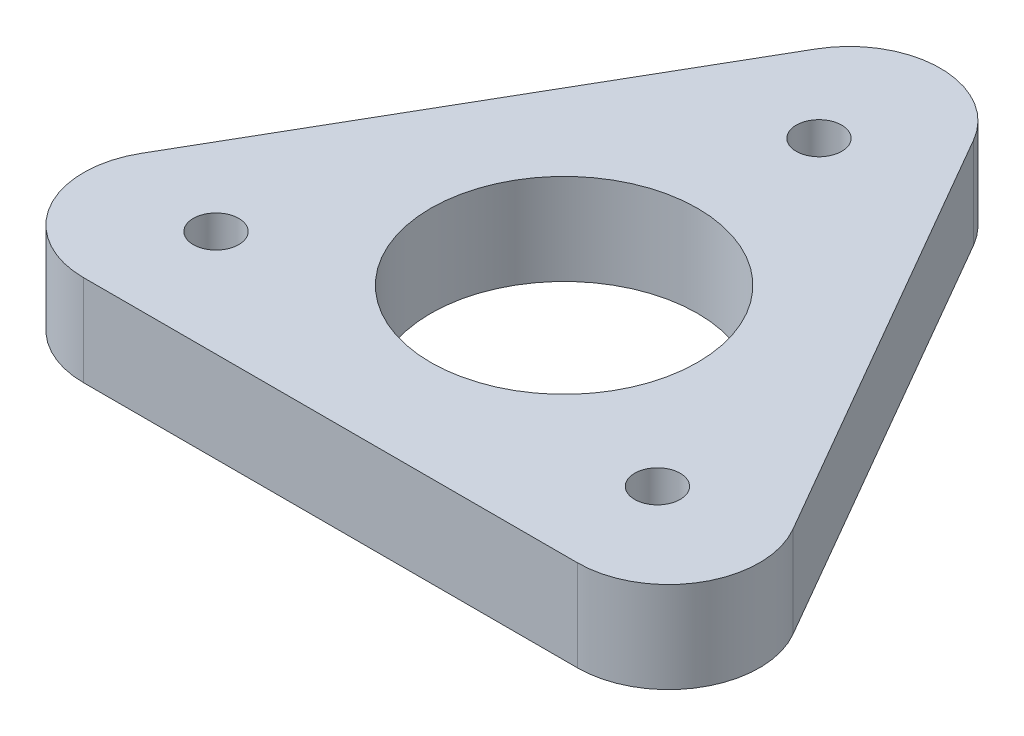
ISO-10303-21;
HEADER;
FILE_DESCRIPTION(('STEP AP214'),'2;1');
FILE_NAME('part.step','',(''),(''),'','','');
FILE_SCHEMA(('AUTOMOTIVE_DESIGN { 1 0 10303 214 1 1 1 1 }'));
ENDSEC;
DATA;
#1=APPLICATION_CONTEXT('core data for automotive mechanical design processes');
#2=APPLICATION_PROTOCOL_DEFINITION('international standard','automotive_design',2000,#1);
#3=PRODUCT_CONTEXT('',#1,'mechanical');
#4=PRODUCT('Part','Part','',(#3));
#5=PRODUCT_RELATED_PRODUCT_CATEGORY('part','',(#4));
#6=PRODUCT_DEFINITION_FORMATION('','',#4);
#7=PRODUCT_DEFINITION_CONTEXT('part definition',#1,'design');
#8=PRODUCT_DEFINITION('design','',#6,#7);
#9=PRODUCT_DEFINITION_SHAPE('','',#8);
#10=(LENGTH_UNIT() NAMED_UNIT(*) SI_UNIT(.MILLI.,.METRE.));
#11=(NAMED_UNIT(*) PLANE_ANGLE_UNIT() SI_UNIT($,.RADIAN.));
#12=(NAMED_UNIT(*) SI_UNIT($,.STERADIAN.) SOLID_ANGLE_UNIT());
#13=UNCERTAINTY_MEASURE_WITH_UNIT(LENGTH_MEASURE(1.E-05),#10,'distance_accuracy_value','');
#14=(GEOMETRIC_REPRESENTATION_CONTEXT(3) GLOBAL_UNCERTAINTY_ASSIGNED_CONTEXT((#13)) GLOBAL_UNIT_ASSIGNED_CONTEXT((#10,
#11,#12)) REPRESENTATION_CONTEXT('',''));
#15=CARTESIAN_POINT('',(0.,0.,0.));
#16=DIRECTION('',(0.,0.,1.));
#17=DIRECTION('',(1.,0.,0.));
#18=AXIS2_PLACEMENT_3D('',#15,#16,#17);
#19=CARTESIAN_POINT('',(8.14063879557373,3.,4.7));
#20=DIRECTION('',(0.,1.,0.));
#21=DIRECTION('',(0.,0.,1.));
#22=AXIS2_PLACEMENT_3D('',#19,#20,#21);
#23=PLANE('',#22);
#24=CARTESIAN_POINT('',(7.27461339178929,3.,4.2));
#25=DIRECTION('',(0.,1.,0.));
#26=DIRECTION('',(0.,0.,1.));
#27=AXIS2_PLACEMENT_3D('',#24,#25,#26);
#28=CIRCLE('',#27,0.75);
#29=CARTESIAN_POINT('',(7.27461339178929,3.,4.95));
#30=VERTEX_POINT('',#29);
#31=EDGE_CURVE('E189',#30,#30,#28,.T.);
#32=ORIENTED_EDGE('',*,*,#31,.F.);
#33=EDGE_LOOP('',(#32));
#34=FACE_BOUND('',#33,.T.);
#35=CARTESIAN_POINT('',(0.,3.,0.));
#36=DIRECTION('',(0.,1.,0.));
#37=DIRECTION('',(0.,0.,1.));
#38=AXIS2_PLACEMENT_3D('',#35,#36,#37);
#39=CIRCLE('',#38,4.4);
#40=CARTESIAN_POINT('',(0.,3.,4.4));
#41=VERTEX_POINT('',#40);
#42=EDGE_CURVE('E122',#41,#41,#39,.T.);
#43=ORIENTED_EDGE('',*,*,#42,.F.);
#44=EDGE_LOOP('',(#43));
#45=FACE_BOUND('',#44,.T.);
#46=CARTESIAN_POINT('',(8.14063879557373,3.,4.7));
#47=DIRECTION('',(0.,1.,0.));
#48=DIRECTION('',(0.,0.,1.));
#49=AXIS2_PLACEMENT_3D('',#46,#47,#48);
#50=CIRCLE('',#49,3.);
#51=CARTESIAN_POINT('',(8.14063879557369,3.,7.7));
#52=VERTEX_POINT('',#51);
#53=CARTESIAN_POINT('',(10.738715006927,3.,3.19999999999996));
#54=VERTEX_POINT('',#53);
#55=EDGE_CURVE('E129',#52,#54,#50,.T.);
#56=ORIENTED_EDGE('',*,*,#55,.T.);
#57=DIRECTION('',(-0.5,0.,-0.866025403784438));
#58=VECTOR('',#57,1.);
#59=CARTESIAN_POINT('',(10.738715006927,3.,3.19999999999996));
#60=LINE('',#59,#58);
#61=CARTESIAN_POINT('',(2.59807621135333,3.,-10.9));
#62=VERTEX_POINT('',#61);
#63=EDGE_CURVE('E87',#54,#62,#60,.T.);
#64=ORIENTED_EDGE('',*,*,#63,.T.);
#65=CARTESIAN_POINT('',(0.,3.,-9.40000000000001));
#66=DIRECTION('',(0.,1.,0.));
#67=DIRECTION('',(0.,0.,-1.));
#68=AXIS2_PLACEMENT_3D('',#65,#66,#67);
#69=CIRCLE('',#68,3.);
#70=CARTESIAN_POINT('',(-2.59807621135334,3.,-10.9));
#71=VERTEX_POINT('',#70);
#72=EDGE_CURVE('E100',#62,#71,#69,.T.);
#73=ORIENTED_EDGE('',*,*,#72,.T.);
#74=DIRECTION('',(-0.5,0.,0.866025403784439));
#75=VECTOR('',#74,1.);
#76=CARTESIAN_POINT('',(-2.59807621135334,3.,-10.9));
#77=LINE('',#76,#75);
#78=CARTESIAN_POINT('',(-10.738715006927,3.,3.19999999999997));
#79=VERTEX_POINT('',#78);
#80=EDGE_CURVE('E94',#71,#79,#77,.T.);
#81=ORIENTED_EDGE('',*,*,#80,.T.);
#82=CARTESIAN_POINT('',(-8.14063879557372,3.,4.7));
#83=DIRECTION('',(0.,1.,0.));
#84=DIRECTION('',(0.,0.,1.));
#85=AXIS2_PLACEMENT_3D('',#82,#83,#84);
#86=CIRCLE('',#85,3.);
#87=CARTESIAN_POINT('',(-8.14063879557368,3.,7.7));
#88=VERTEX_POINT('',#87);
#89=EDGE_CURVE('E98',#79,#88,#86,.T.);
#90=ORIENTED_EDGE('',*,*,#89,.T.);
#91=DIRECTION('',(1.,0.,0.));
#92=VECTOR('',#91,1.);
#93=CARTESIAN_POINT('',(-8.14063879557368,3.,7.7));
#94=LINE('',#93,#92);
#95=EDGE_CURVE('E50',#88,#52,#94,.T.);
#96=ORIENTED_EDGE('',*,*,#95,.T.);
#97=EDGE_LOOP('',(#56,#64,#73,#81,#90,#96));
#98=FACE_BOUND('',#97,.T.);
#99=CARTESIAN_POINT('',(0.,3.,-8.4));
#100=DIRECTION('',(0.,1.,0.));
#101=DIRECTION('',(0.,0.,1.));
#102=AXIS2_PLACEMENT_3D('',#99,#100,#101);
#103=CIRCLE('',#102,0.75);
#104=CARTESIAN_POINT('',(0.,3.,-7.65));
#105=VERTEX_POINT('',#104);
#106=EDGE_CURVE('E195',#105,#105,#103,.T.);
#107=ORIENTED_EDGE('',*,*,#106,.F.);
#108=EDGE_LOOP('',(#107));
#109=FACE_BOUND('',#108,.T.);
#110=CARTESIAN_POINT('',(-7.27461339178928,3.,4.2));
#111=DIRECTION('',(0.,1.,0.));
#112=DIRECTION('',(0.,0.,1.));
#113=AXIS2_PLACEMENT_3D('',#110,#111,#112);
#114=CIRCLE('',#113,0.750000000000001);
#115=CARTESIAN_POINT('',(-7.27461339178928,3.,4.95000000000001));
#116=VERTEX_POINT('',#115);
#117=EDGE_CURVE('E180',#116,#116,#114,.T.);
#118=ORIENTED_EDGE('',*,*,#117,.F.);
#119=EDGE_LOOP('',(#118));
#120=FACE_BOUND('',#119,.T.);
#121=ADVANCED_FACE('F33',(#34,#45,#98,#109,#120),#23,.T.);
#122=CARTESIAN_POINT('',(8.14063879557373,0.,4.7));
#123=DIRECTION('',(0.,1.,0.));
#124=DIRECTION('',(0.,0.,1.));
#125=AXIS2_PLACEMENT_3D('',#122,#123,#124);
#126=PLANE('',#125);
#127=CARTESIAN_POINT('',(8.14063879557373,0.,4.7));
#128=DIRECTION('',(0.,1.,0.));
#129=DIRECTION('',(0.,0.,1.));
#130=AXIS2_PLACEMENT_3D('',#127,#128,#129);
#131=CIRCLE('',#130,3.);
#132=CARTESIAN_POINT('',(8.14063879557369,0.,7.7));
#133=VERTEX_POINT('',#132);
#134=CARTESIAN_POINT('',(10.738715006927,0.,3.19999999999996));
#135=VERTEX_POINT('',#134);
#136=EDGE_CURVE('E118',#133,#135,#131,.T.);
#137=ORIENTED_EDGE('',*,*,#136,.F.);
#138=DIRECTION('',(1.,0.,0.));
#139=VECTOR('',#138,1.);
#140=CARTESIAN_POINT('',(-8.14063879557368,0.,7.7));
#141=LINE('',#140,#139);
#142=CARTESIAN_POINT('',(-8.14063879557368,0.,7.7));
#143=VERTEX_POINT('',#142);
#144=EDGE_CURVE('E79',#143,#133,#141,.T.);
#145=ORIENTED_EDGE('',*,*,#144,.F.);
#146=CARTESIAN_POINT('',(-8.14063879557372,0.,4.7));
#147=DIRECTION('',(0.,1.,0.));
#148=DIRECTION('',(0.,0.,1.));
#149=AXIS2_PLACEMENT_3D('',#146,#147,#148);
#150=CIRCLE('',#149,3.);
#151=CARTESIAN_POINT('',(-10.738715006927,0.,3.19999999999997));
#152=VERTEX_POINT('',#151);
#153=EDGE_CURVE('E73',#152,#143,#150,.T.);
#154=ORIENTED_EDGE('',*,*,#153,.F.);
#155=DIRECTION('',(-0.5,0.,0.866025403784439));
#156=VECTOR('',#155,1.);
#157=CARTESIAN_POINT('',(-2.59807621135334,0.,-10.9));
#158=LINE('',#157,#156);
#159=CARTESIAN_POINT('',(-2.59807621135334,0.,-10.9));
#160=VERTEX_POINT('',#159);
#161=EDGE_CURVE('E108',#160,#152,#158,.T.);
#162=ORIENTED_EDGE('',*,*,#161,.F.);
#163=CARTESIAN_POINT('',(0.,0.,-9.40000000000001));
#164=DIRECTION('',(0.,1.,0.));
#165=DIRECTION('',(0.,0.,-1.));
#166=AXIS2_PLACEMENT_3D('',#163,#164,#165);
#167=CIRCLE('',#166,3.);
#168=CARTESIAN_POINT('',(2.59807621135333,0.,-10.9));
#169=VERTEX_POINT('',#168);
#170=EDGE_CURVE('E124',#169,#160,#167,.T.);
#171=ORIENTED_EDGE('',*,*,#170,.F.);
#172=DIRECTION('',(-0.5,0.,-0.866025403784438));
#173=VECTOR('',#172,1.);
#174=CARTESIAN_POINT('',(10.738715006927,0.,3.19999999999996));
#175=LINE('',#174,#173);
#176=EDGE_CURVE('E121',#135,#169,#175,.T.);
#177=ORIENTED_EDGE('',*,*,#176,.F.);
#178=EDGE_LOOP('',(#137,#145,#154,#162,#171,#177));
#179=FACE_BOUND('',#178,.T.);
#180=CARTESIAN_POINT('',(0.,0.,0.));
#181=DIRECTION('',(0.,1.,0.));
#182=DIRECTION('',(0.,0.,1.));
#183=AXIS2_PLACEMENT_3D('',#180,#181,#182);
#184=CIRCLE('',#183,4.4);
#185=CARTESIAN_POINT('',(0.,0.,4.4));
#186=VERTEX_POINT('',#185);
#187=EDGE_CURVE('E198',#186,#186,#184,.T.);
#188=ORIENTED_EDGE('',*,*,#187,.T.);
#189=EDGE_LOOP('',(#188));
#190=FACE_BOUND('',#189,.T.);
#191=CARTESIAN_POINT('',(0.,0.,-8.4));
#192=DIRECTION('',(0.,1.,0.));
#193=DIRECTION('',(0.,0.,1.));
#194=AXIS2_PLACEMENT_3D('',#191,#192,#193);
#195=CIRCLE('',#194,0.75);
#196=CARTESIAN_POINT('',(0.,0.,-7.65));
#197=VERTEX_POINT('',#196);
#198=EDGE_CURVE('E192',#197,#197,#195,.T.);
#199=ORIENTED_EDGE('',*,*,#198,.T.);
#200=EDGE_LOOP('',(#199));
#201=FACE_BOUND('',#200,.T.);
#202=CARTESIAN_POINT('',(7.27461339178929,0.,4.2));
#203=DIRECTION('',(0.,1.,0.));
#204=DIRECTION('',(0.,0.,1.));
#205=AXIS2_PLACEMENT_3D('',#202,#203,#204);
#206=CIRCLE('',#205,0.75);
#207=CARTESIAN_POINT('',(7.27461339178929,0.,4.95));
#208=VERTEX_POINT('',#207);
#209=EDGE_CURVE('E186',#208,#208,#206,.T.);
#210=ORIENTED_EDGE('',*,*,#209,.T.);
#211=EDGE_LOOP('',(#210));
#212=FACE_BOUND('',#211,.T.);
#213=CARTESIAN_POINT('',(-7.27461339178928,0.,4.2));
#214=DIRECTION('',(0.,1.,0.));
#215=DIRECTION('',(0.,0.,1.));
#216=AXIS2_PLACEMENT_3D('',#213,#214,#215);
#217=CIRCLE('',#216,0.750000000000001);
#218=CARTESIAN_POINT('',(-7.27461339178928,0.,4.95000000000001));
#219=VERTEX_POINT('',#218);
#220=EDGE_CURVE('E183',#219,#219,#217,.T.);
#221=ORIENTED_EDGE('',*,*,#220,.T.);
#222=EDGE_LOOP('',(#221));
#223=FACE_BOUND('',#222,.T.);
#224=ADVANCED_FACE('F138',(#179,#190,#201,#212,#223),#126,.F.);
#225=CARTESIAN_POINT('',(8.14063879557373,3.,4.7));
#226=DIRECTION('',(0.,-1.,0.));
#227=DIRECTION('',(0.,0.,-1.));
#228=AXIS2_PLACEMENT_3D('',#225,#226,#227);
#229=CYLINDRICAL_SURFACE('',#228,3.);
#230=ORIENTED_EDGE('',*,*,#136,.T.);
#231=DIRECTION('',(0.,-1.,0.));
#232=VECTOR('',#231,1.);
#233=CARTESIAN_POINT('',(10.738715006927,3.,3.19999999999996));
#234=LINE('',#233,#232);
#235=EDGE_CURVE('E11',#54,#135,#234,.T.);
#236=ORIENTED_EDGE('',*,*,#235,.F.);
#237=ORIENTED_EDGE('',*,*,#55,.F.);
#238=DIRECTION('',(0.,-1.,0.));
#239=VECTOR('',#238,1.);
#240=CARTESIAN_POINT('',(8.14063879557369,3.,7.7));
#241=LINE('',#240,#239);
#242=EDGE_CURVE('E114',#52,#133,#241,.T.);
#243=ORIENTED_EDGE('',*,*,#242,.T.);
#244=EDGE_LOOP('',(#230,#236,#237,#243));
#245=FACE_BOUND('',#244,.T.);
#246=ADVANCED_FACE('F35',(#245),#229,.T.);
#247=CARTESIAN_POINT('',(10.738715006927,3.,3.19999999999996));
#248=DIRECTION('',(-0.866025403784438,0.,0.5));
#249=DIRECTION('',(0.5,0.,0.866025403784438));
#250=AXIS2_PLACEMENT_3D('',#247,#248,#249);
#251=PLANE('',#250);
#252=ORIENTED_EDGE('',*,*,#176,.T.);
#253=DIRECTION('',(0.,-1.,0.));
#254=VECTOR('',#253,1.);
#255=CARTESIAN_POINT('',(2.59807621135333,3.,-10.9));
#256=LINE('',#255,#254);
#257=EDGE_CURVE('E42',#62,#169,#256,.T.);
#258=ORIENTED_EDGE('',*,*,#257,.F.);
#259=ORIENTED_EDGE('',*,*,#63,.F.);
#260=ORIENTED_EDGE('',*,*,#235,.T.);
#261=EDGE_LOOP('',(#252,#258,#259,#260));
#262=FACE_BOUND('',#261,.T.);
#263=ADVANCED_FACE('F256',(#262),#251,.F.);
#264=CARTESIAN_POINT('',(0.,3.,-9.40000000000001));
#265=DIRECTION('',(0.,-1.,0.));
#266=DIRECTION('',(0.,0.,-1.));
#267=AXIS2_PLACEMENT_3D('',#264,#265,#266);
#268=CYLINDRICAL_SURFACE('',#267,3.);
#269=ORIENTED_EDGE('',*,*,#170,.T.);
#270=DIRECTION('',(0.,-1.,0.));
#271=VECTOR('',#270,1.);
#272=CARTESIAN_POINT('',(-2.59807621135334,3.,-10.9));
#273=LINE('',#272,#271);
#274=EDGE_CURVE('E109',#71,#160,#273,.T.);
#275=ORIENTED_EDGE('',*,*,#274,.F.);
#276=ORIENTED_EDGE('',*,*,#72,.F.);
#277=ORIENTED_EDGE('',*,*,#257,.T.);
#278=EDGE_LOOP('',(#269,#275,#276,#277));
#279=FACE_BOUND('',#278,.T.);
#280=ADVANCED_FACE('F135',(#279),#268,.T.);
#281=CARTESIAN_POINT('',(-2.59807621135334,3.,-10.9));
#282=DIRECTION('',(0.866025403784439,0.,0.5));
#283=DIRECTION('',(0.5,0.,-0.866025403784439));
#284=AXIS2_PLACEMENT_3D('',#281,#282,#283);
#285=PLANE('',#284);
#286=ORIENTED_EDGE('',*,*,#161,.T.);
#287=DIRECTION('',(0.,-1.,0.));
#288=VECTOR('',#287,1.);
#289=CARTESIAN_POINT('',(-10.738715006927,3.,3.19999999999997));
#290=LINE('',#289,#288);
#291=EDGE_CURVE('E105',#79,#152,#290,.T.);
#292=ORIENTED_EDGE('',*,*,#291,.F.);
#293=ORIENTED_EDGE('',*,*,#80,.F.);
#294=ORIENTED_EDGE('',*,*,#274,.T.);
#295=EDGE_LOOP('',(#286,#292,#293,#294));
#296=FACE_BOUND('',#295,.T.);
#297=ADVANCED_FACE('F106',(#296),#285,.F.);
#298=CARTESIAN_POINT('',(-8.14063879557372,3.,4.7));
#299=DIRECTION('',(0.,-1.,0.));
#300=DIRECTION('',(0.,0.,-1.));
#301=AXIS2_PLACEMENT_3D('',#298,#299,#300);
#302=CYLINDRICAL_SURFACE('',#301,3.);
#303=ORIENTED_EDGE('',*,*,#153,.T.);
#304=DIRECTION('',(0.,-1.,0.));
#305=VECTOR('',#304,1.);
#306=CARTESIAN_POINT('',(-8.14063879557368,3.,7.7));
#307=LINE('',#306,#305);
#308=EDGE_CURVE('E110',#88,#143,#307,.T.);
#309=ORIENTED_EDGE('',*,*,#308,.F.);
#310=ORIENTED_EDGE('',*,*,#89,.F.);
#311=ORIENTED_EDGE('',*,*,#291,.T.);
#312=EDGE_LOOP('',(#303,#309,#310,#311));
#313=FACE_BOUND('',#312,.T.);
#314=ADVANCED_FACE('F112',(#313),#302,.T.);
#315=CARTESIAN_POINT('',(-8.14063879557368,3.,7.7));
#316=DIRECTION('',(0.,0.,-1.));
#317=DIRECTION('',(-1.,0.,0.));
#318=AXIS2_PLACEMENT_3D('',#315,#316,#317);
#319=PLANE('',#318);
#320=ORIENTED_EDGE('',*,*,#144,.T.);
#321=ORIENTED_EDGE('',*,*,#242,.F.);
#322=ORIENTED_EDGE('',*,*,#95,.F.);
#323=ORIENTED_EDGE('',*,*,#308,.T.);
#324=EDGE_LOOP('',(#320,#321,#322,#323));
#325=FACE_BOUND('',#324,.T.);
#326=ADVANCED_FACE('F143',(#325),#319,.F.);
#327=CARTESIAN_POINT('',(0.,3.,0.));
#328=DIRECTION('',(0.,-1.,0.));
#329=DIRECTION('',(0.,0.,-1.));
#330=AXIS2_PLACEMENT_3D('',#327,#328,#329);
#331=CYLINDRICAL_SURFACE('',#330,4.4);
#332=ORIENTED_EDGE('',*,*,#42,.T.);
#333=EDGE_LOOP('',(#332));
#334=FACE_BOUND('',#333,.T.);
#335=ORIENTED_EDGE('',*,*,#187,.F.);
#336=EDGE_LOOP('',(#335));
#337=FACE_BOUND('',#336,.T.);
#338=ADVANCED_FACE('F145',(#334,#337),#331,.F.);
#339=CARTESIAN_POINT('',(0.,3.,-8.4));
#340=DIRECTION('',(0.,-1.,0.));
#341=DIRECTION('',(0.,0.,-1.));
#342=AXIS2_PLACEMENT_3D('',#339,#340,#341);
#343=CYLINDRICAL_SURFACE('',#342,0.75);
#344=ORIENTED_EDGE('',*,*,#106,.T.);
#345=EDGE_LOOP('',(#344));
#346=FACE_BOUND('',#345,.T.);
#347=ORIENTED_EDGE('',*,*,#198,.F.);
#348=EDGE_LOOP('',(#347));
#349=FACE_BOUND('',#348,.T.);
#350=ADVANCED_FACE('F151',(#346,#349),#343,.F.);
#351=CARTESIAN_POINT('',(7.27461339178929,3.,4.2));
#352=DIRECTION('',(0.,-1.,0.));
#353=DIRECTION('',(0.,0.,-1.));
#354=AXIS2_PLACEMENT_3D('',#351,#352,#353);
#355=CYLINDRICAL_SURFACE('',#354,0.75);
#356=ORIENTED_EDGE('',*,*,#31,.T.);
#357=EDGE_LOOP('',(#356));
#358=FACE_BOUND('',#357,.T.);
#359=ORIENTED_EDGE('',*,*,#209,.F.);
#360=EDGE_LOOP('',(#359));
#361=FACE_BOUND('',#360,.T.);
#362=ADVANCED_FACE('F167',(#358,#361),#355,.F.);
#363=CARTESIAN_POINT('',(-7.27461339178928,3.,4.2));
#364=DIRECTION('',(0.,-1.,0.));
#365=DIRECTION('',(0.,0.,-1.));
#366=AXIS2_PLACEMENT_3D('',#363,#364,#365);
#367=CYLINDRICAL_SURFACE('',#366,0.750000000000001);
#368=ORIENTED_EDGE('',*,*,#117,.T.);
#369=EDGE_LOOP('',(#368));
#370=FACE_BOUND('',#369,.T.);
#371=ORIENTED_EDGE('',*,*,#220,.F.);
#372=EDGE_LOOP('',(#371));
#373=FACE_BOUND('',#372,.T.);
#374=ADVANCED_FACE('F171',(#370,#373),#367,.F.);
#375=CLOSED_SHELL('',(#121,#224,#246,#263,#280,#297,#314,#326,#338,#350,#362,#374));
#376=MANIFOLD_SOLID_BREP('B2',#375);
#377=ADVANCED_BREP_SHAPE_REPRESENTATION('',(#18,#376),#14);
#378=SHAPE_DEFINITION_REPRESENTATION(#9,#377);
ENDSEC;
END-ISO-10303-21;
